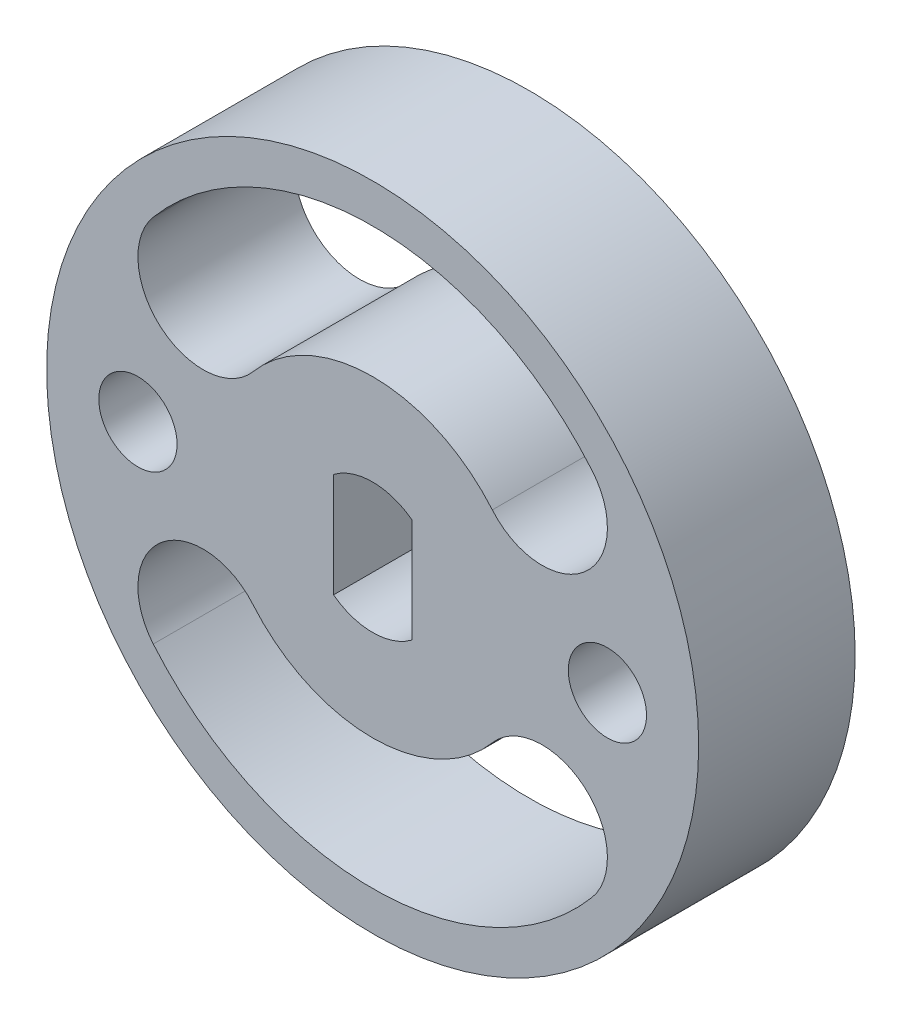
ISO-10303-21;
HEADER;
FILE_DESCRIPTION(('STEP AP214'),'2;1');
FILE_NAME('part.step','',(''),(''),'','','');
FILE_SCHEMA(('AUTOMOTIVE_DESIGN { 1 0 10303 214 1 1 1 1 }'));
ENDSEC;
DATA;
#1=APPLICATION_CONTEXT('core data for automotive mechanical design processes');
#2=APPLICATION_PROTOCOL_DEFINITION('international standard','automotive_design',2000,#1);
#3=PRODUCT_CONTEXT('',#1,'mechanical');
#4=PRODUCT('Part','Part','',(#3));
#5=PRODUCT_RELATED_PRODUCT_CATEGORY('part','',(#4));
#6=PRODUCT_DEFINITION_FORMATION('','',#4);
#7=PRODUCT_DEFINITION_CONTEXT('part definition',#1,'design');
#8=PRODUCT_DEFINITION('design','',#6,#7);
#9=PRODUCT_DEFINITION_SHAPE('','',#8);
#10=(LENGTH_UNIT() NAMED_UNIT(*) SI_UNIT(.MILLI.,.METRE.));
#11=(NAMED_UNIT(*) PLANE_ANGLE_UNIT() SI_UNIT($,.RADIAN.));
#12=(NAMED_UNIT(*) SI_UNIT($,.STERADIAN.) SOLID_ANGLE_UNIT());
#13=UNCERTAINTY_MEASURE_WITH_UNIT(LENGTH_MEASURE(1.E-05),#10,'distance_accuracy_value','');
#14=(GEOMETRIC_REPRESENTATION_CONTEXT(3) GLOBAL_UNCERTAINTY_ASSIGNED_CONTEXT((#13)) GLOBAL_UNIT_ASSIGNED_CONTEXT((#10,
#11,#12)) REPRESENTATION_CONTEXT('',''));
#15=CARTESIAN_POINT('',(0.,0.,0.));
#16=DIRECTION('',(0.,0.,1.));
#17=DIRECTION('',(1.,0.,0.));
#18=AXIS2_PLACEMENT_3D('',#15,#16,#17);
#19=CARTESIAN_POINT('',(0.,0.,6.));
#20=DIRECTION('',(0.,0.,-1.));
#21=DIRECTION('',(-1.,0.,0.));
#22=AXIS2_PLACEMENT_3D('',#19,#20,#21);
#23=CYLINDRICAL_SURFACE('',#22,2.49999999999997);
#24=CARTESIAN_POINT('',(0.,0.,0.));
#25=DIRECTION('',(0.,0.,-1.));
#26=DIRECTION('',(-1.,0.,0.));
#27=AXIS2_PLACEMENT_3D('',#24,#25,#26);
#28=CIRCLE('',#27,2.49999999999997);
#29=CARTESIAN_POINT('',(-1.5,2.,0.));
#30=VERTEX_POINT('',#29);
#31=CARTESIAN_POINT('',(1.5,2.,0.));
#32=VERTEX_POINT('',#31);
#33=EDGE_CURVE('E251',#30,#32,#28,.T.);
#34=ORIENTED_EDGE('',*,*,#33,.T.);
#35=DIRECTION('',(0.,0.,-1.));
#36=VECTOR('',#35,1.);
#37=CARTESIAN_POINT('',(1.5,2.,6.));
#38=LINE('',#37,#36);
#39=CARTESIAN_POINT('',(1.5,2.,6.));
#40=VERTEX_POINT('',#39);
#41=EDGE_CURVE('E11',#40,#32,#38,.T.);
#42=ORIENTED_EDGE('',*,*,#41,.F.);
#43=CARTESIAN_POINT('',(0.,0.,6.));
#44=DIRECTION('',(0.,0.,-1.));
#45=DIRECTION('',(-1.,0.,0.));
#46=AXIS2_PLACEMENT_3D('',#43,#44,#45);
#47=CIRCLE('',#46,2.49999999999997);
#48=CARTESIAN_POINT('',(-1.5,2.,6.));
#49=VERTEX_POINT('',#48);
#50=EDGE_CURVE('E252',#49,#40,#47,.T.);
#51=ORIENTED_EDGE('',*,*,#50,.F.);
#52=DIRECTION('',(0.,0.,-1.));
#53=VECTOR('',#52,1.);
#54=CARTESIAN_POINT('',(-1.5,2.,6.));
#55=LINE('',#54,#53);
#56=EDGE_CURVE('E242',#49,#30,#55,.T.);
#57=ORIENTED_EDGE('',*,*,#56,.T.);
#58=EDGE_LOOP('',(#34,#42,#51,#57));
#59=FACE_BOUND('',#58,.T.);
#60=ADVANCED_FACE('F39',(#59),#23,.F.);
#61=CARTESIAN_POINT('',(1.5,2.,6.));
#62=DIRECTION('',(1.,0.,0.));
#63=DIRECTION('',(0.,1.,0.));
#64=AXIS2_PLACEMENT_3D('',#61,#62,#63);
#65=PLANE('',#64);
#66=DIRECTION('',(0.,-1.,0.));
#67=VECTOR('',#66,1.);
#68=CARTESIAN_POINT('',(1.5,2.,0.));
#69=LINE('',#68,#67);
#70=CARTESIAN_POINT('',(1.5,-2.,0.));
#71=VERTEX_POINT('',#70);
#72=EDGE_CURVE('E270',#32,#71,#69,.T.);
#73=ORIENTED_EDGE('',*,*,#72,.T.);
#74=DIRECTION('',(0.,0.,-1.));
#75=VECTOR('',#74,1.);
#76=CARTESIAN_POINT('',(1.5,-2.,6.));
#77=LINE('',#76,#75);
#78=CARTESIAN_POINT('',(1.5,-2.,6.));
#79=VERTEX_POINT('',#78);
#80=EDGE_CURVE('E186',#79,#71,#77,.T.);
#81=ORIENTED_EDGE('',*,*,#80,.F.);
#82=DIRECTION('',(0.,-1.,0.));
#83=VECTOR('',#82,1.);
#84=CARTESIAN_POINT('',(1.5,2.,6.));
#85=LINE('',#84,#83);
#86=EDGE_CURVE('E256',#40,#79,#85,.T.);
#87=ORIENTED_EDGE('',*,*,#86,.F.);
#88=ORIENTED_EDGE('',*,*,#41,.T.);
#89=EDGE_LOOP('',(#73,#81,#87,#88));
#90=FACE_BOUND('',#89,.T.);
#91=ADVANCED_FACE('F307',(#90),#65,.F.);
#92=CARTESIAN_POINT('',(9.,0.,6.));
#93=DIRECTION('',(0.,0.,-1.));
#94=DIRECTION('',(-1.,0.,0.));
#95=AXIS2_PLACEMENT_3D('',#92,#93,#94);
#96=CYLINDRICAL_SURFACE('',#95,1.5);
#97=CARTESIAN_POINT('',(9.,0.,0.));
#98=DIRECTION('',(0.,0.,-1.));
#99=DIRECTION('',(-1.,0.,0.));
#100=AXIS2_PLACEMENT_3D('',#97,#98,#99);
#101=CIRCLE('',#100,1.5);
#102=CARTESIAN_POINT('',(7.5,0.,0.));
#103=VERTEX_POINT('',#102);
#104=EDGE_CURVE('E273',#103,#103,#101,.T.);
#105=ORIENTED_EDGE('',*,*,#104,.T.);
#106=EDGE_LOOP('',(#105));
#107=FACE_BOUND('',#106,.T.);
#108=CARTESIAN_POINT('',(9.,0.,6.));
#109=DIRECTION('',(0.,0.,-1.));
#110=DIRECTION('',(-1.,0.,0.));
#111=AXIS2_PLACEMENT_3D('',#108,#109,#110);
#112=CIRCLE('',#111,1.5);
#113=CARTESIAN_POINT('',(7.5,0.,6.));
#114=VERTEX_POINT('',#113);
#115=EDGE_CURVE('E260',#114,#114,#112,.T.);
#116=ORIENTED_EDGE('',*,*,#115,.F.);
#117=EDGE_LOOP('',(#116));
#118=FACE_BOUND('',#117,.T.);
#119=ADVANCED_FACE('F309',(#107,#118),#96,.F.);
#120=CARTESIAN_POINT('',(0.,0.,6.));
#121=DIRECTION('',(0.,0.,-1.));
#122=DIRECTION('',(-1.,0.,0.));
#123=AXIS2_PLACEMENT_3D('',#120,#121,#122);
#124=CYLINDRICAL_SURFACE('',#123,12.5);
#125=CARTESIAN_POINT('',(0.,0.,0.));
#126=DIRECTION('',(0.,0.,1.));
#127=DIRECTION('',(1.,0.,0.));
#128=AXIS2_PLACEMENT_3D('',#125,#126,#127);
#129=CIRCLE('',#128,12.5);
#130=CARTESIAN_POINT('',(12.5,0.,0.));
#131=VERTEX_POINT('',#130);
#132=EDGE_CURVE('E257',#131,#131,#129,.T.);
#133=ORIENTED_EDGE('',*,*,#132,.T.);
#134=EDGE_LOOP('',(#133));
#135=FACE_BOUND('',#134,.T.);
#136=CARTESIAN_POINT('',(0.,0.,6.));
#137=DIRECTION('',(0.,0.,1.));
#138=DIRECTION('',(1.,0.,0.));
#139=AXIS2_PLACEMENT_3D('',#136,#137,#138);
#140=CIRCLE('',#139,12.5);
#141=CARTESIAN_POINT('',(12.5,0.,6.));
#142=VERTEX_POINT('',#141);
#143=EDGE_CURVE('E47',#142,#142,#140,.T.);
#144=ORIENTED_EDGE('',*,*,#143,.F.);
#145=EDGE_LOOP('',(#144));
#146=FACE_BOUND('',#145,.T.);
#147=ADVANCED_FACE('F280',(#135,#146),#124,.T.);
#148=CARTESIAN_POINT('',(0.,0.,6.));
#149=DIRECTION('',(0.,0.,-1.));
#150=DIRECTION('',(-1.,0.,0.));
#151=AXIS2_PLACEMENT_3D('',#148,#149,#150);
#152=PLANE('',#151);
#153=ORIENTED_EDGE('',*,*,#115,.T.);
#154=EDGE_LOOP('',(#153));
#155=FACE_BOUND('',#154,.T.);
#156=ORIENTED_EDGE('',*,*,#143,.T.);
#157=EDGE_LOOP('',(#156));
#158=FACE_BOUND('',#157,.T.);
#159=CARTESIAN_POINT('',(-9.,0.,6.));
#160=DIRECTION('',(0.,0.,1.));
#161=DIRECTION('',(1.,0.,0.));
#162=AXIS2_PLACEMENT_3D('',#159,#160,#161);
#163=CIRCLE('',#162,1.5);
#164=CARTESIAN_POINT('',(-7.5,0.,6.));
#165=VERTEX_POINT('',#164);
#166=EDGE_CURVE('E237',#165,#165,#163,.T.);
#167=ORIENTED_EDGE('',*,*,#166,.F.);
#168=EDGE_LOOP('',(#167));
#169=FACE_BOUND('',#168,.T.);
#170=CARTESIAN_POINT('',(-6.5,5.47722557505166,6.));
#171=DIRECTION('',(0.,0.,1.));
#172=DIRECTION('',(1.,0.,0.));
#173=AXIS2_PLACEMENT_3D('',#170,#171,#172);
#174=CIRCLE('',#173,2.5);
#175=CARTESIAN_POINT('',(-8.41176470588235,7.08817427359627,6.));
#176=VERTEX_POINT('',#175);
#177=CARTESIAN_POINT('',(-4.58823529411765,3.86627687650706,6.));
#178=VERTEX_POINT('',#177);
#179=EDGE_CURVE('E197',#176,#178,#174,.T.);
#180=ORIENTED_EDGE('',*,*,#179,.F.);
#181=CARTESIAN_POINT('',(0.,0.,6.));
#182=DIRECTION('',(0.,0.,1.));
#183=DIRECTION('',(1.,0.,0.));
#184=AXIS2_PLACEMENT_3D('',#181,#182,#183);
#185=CIRCLE('',#184,11.);
#186=CARTESIAN_POINT('',(8.41176470588235,7.08817427359627,6.));
#187=VERTEX_POINT('',#186);
#188=EDGE_CURVE('E201',#187,#176,#185,.T.);
#189=ORIENTED_EDGE('',*,*,#188,.F.);
#190=CARTESIAN_POINT('',(6.5,5.47722557505166,6.));
#191=DIRECTION('',(0.,0.,1.));
#192=DIRECTION('',(1.,0.,0.));
#193=AXIS2_PLACEMENT_3D('',#190,#191,#192);
#194=CIRCLE('',#193,2.5);
#195=CARTESIAN_POINT('',(4.58823529411765,3.86627687650706,6.));
#196=VERTEX_POINT('',#195);
#197=EDGE_CURVE('E193',#196,#187,#194,.T.);
#198=ORIENTED_EDGE('',*,*,#197,.F.);
#199=CARTESIAN_POINT('',(0.,0.,6.));
#200=DIRECTION('',(0.,0.,-1.));
#201=DIRECTION('',(1.,0.,0.));
#202=AXIS2_PLACEMENT_3D('',#199,#200,#201);
#203=CIRCLE('',#202,6.);
#204=EDGE_CURVE('E54',#178,#196,#203,.T.);
#205=ORIENTED_EDGE('',*,*,#204,.F.);
#206=EDGE_LOOP('',(#180,#189,#198,#205));
#207=FACE_BOUND('',#206,.T.);
#208=ORIENTED_EDGE('',*,*,#50,.T.);
#209=ORIENTED_EDGE('',*,*,#86,.T.);
#210=CARTESIAN_POINT('',(0.,0.,6.));
#211=DIRECTION('',(0.,0.,1.));
#212=DIRECTION('',(-1.,0.,0.));
#213=AXIS2_PLACEMENT_3D('',#210,#211,#212);
#214=CIRCLE('',#213,2.49999999999997);
#215=CARTESIAN_POINT('',(-1.5,-2.,6.));
#216=VERTEX_POINT('',#215);
#217=EDGE_CURVE('E182',#216,#79,#214,.T.);
#218=ORIENTED_EDGE('',*,*,#217,.F.);
#219=DIRECTION('',(0.,-1.,0.));
#220=VECTOR('',#219,1.);
#221=CARTESIAN_POINT('',(-1.5,2.,6.));
#222=LINE('',#221,#220);
#223=EDGE_CURVE('E234',#49,#216,#222,.T.);
#224=ORIENTED_EDGE('',*,*,#223,.F.);
#225=EDGE_LOOP('',(#208,#209,#218,#224));
#226=FACE_BOUND('',#225,.T.);
#227=CARTESIAN_POINT('',(-6.5,-5.47722557505166,6.));
#228=DIRECTION('',(0.,0.,-1.));
#229=DIRECTION('',(1.,0.,0.));
#230=AXIS2_PLACEMENT_3D('',#227,#228,#229);
#231=CIRCLE('',#230,2.5);
#232=CARTESIAN_POINT('',(-8.41176470588235,-7.08817427359627,6.));
#233=VERTEX_POINT('',#232);
#234=CARTESIAN_POINT('',(-4.58823529411765,-3.86627687650706,6.));
#235=VERTEX_POINT('',#234);
#236=EDGE_CURVE('E135',#233,#235,#231,.T.);
#237=ORIENTED_EDGE('',*,*,#236,.T.);
#238=CARTESIAN_POINT('',(0.,0.,6.));
#239=DIRECTION('',(0.,0.,1.));
#240=DIRECTION('',(1.,0.,0.));
#241=AXIS2_PLACEMENT_3D('',#238,#239,#240);
#242=CIRCLE('',#241,6.);
#243=CARTESIAN_POINT('',(4.58823529411765,-3.86627687650706,6.));
#244=VERTEX_POINT('',#243);
#245=EDGE_CURVE('E156',#235,#244,#242,.T.);
#246=ORIENTED_EDGE('',*,*,#245,.T.);
#247=CARTESIAN_POINT('',(6.5,-5.47722557505166,6.));
#248=DIRECTION('',(0.,0.,-1.));
#249=DIRECTION('',(1.,0.,0.));
#250=AXIS2_PLACEMENT_3D('',#247,#248,#249);
#251=CIRCLE('',#250,2.5);
#252=CARTESIAN_POINT('',(8.41176470588235,-7.08817427359627,6.));
#253=VERTEX_POINT('',#252);
#254=EDGE_CURVE('E163',#244,#253,#251,.T.);
#255=ORIENTED_EDGE('',*,*,#254,.T.);
#256=CARTESIAN_POINT('',(0.,0.,6.));
#257=DIRECTION('',(0.,0.,-1.));
#258=DIRECTION('',(1.,0.,0.));
#259=AXIS2_PLACEMENT_3D('',#256,#257,#258);
#260=CIRCLE('',#259,11.);
#261=EDGE_CURVE('E360',#253,#233,#260,.T.);
#262=ORIENTED_EDGE('',*,*,#261,.T.);
#263=EDGE_LOOP('',(#237,#246,#255,#262));
#264=FACE_BOUND('',#263,.T.);
#265=ADVANCED_FACE('F286',(#155,#158,#169,#207,#226,#264),#152,.F.);
#266=CARTESIAN_POINT('',(0.,0.,0.));
#267=DIRECTION('',(0.,0.,-1.));
#268=DIRECTION('',(-1.,0.,0.));
#269=AXIS2_PLACEMENT_3D('',#266,#267,#268);
#270=PLANE('',#269);
#271=ORIENTED_EDGE('',*,*,#104,.F.);
#272=EDGE_LOOP('',(#271));
#273=FACE_BOUND('',#272,.T.);
#274=ORIENTED_EDGE('',*,*,#132,.F.);
#275=EDGE_LOOP('',(#274));
#276=FACE_BOUND('',#275,.T.);
#277=CARTESIAN_POINT('',(-9.,0.,0.));
#278=DIRECTION('',(0.,0.,1.));
#279=DIRECTION('',(1.,0.,0.));
#280=AXIS2_PLACEMENT_3D('',#277,#278,#279);
#281=CIRCLE('',#280,1.5);
#282=CARTESIAN_POINT('',(-7.5,0.,0.));
#283=VERTEX_POINT('',#282);
#284=EDGE_CURVE('E238',#283,#283,#281,.T.);
#285=ORIENTED_EDGE('',*,*,#284,.T.);
#286=EDGE_LOOP('',(#285));
#287=FACE_BOUND('',#286,.T.);
#288=CARTESIAN_POINT('',(0.,0.,0.));
#289=DIRECTION('',(0.,0.,-1.));
#290=DIRECTION('',(-1.,0.,0.));
#291=AXIS2_PLACEMENT_3D('',#288,#289,#290);
#292=CIRCLE('',#291,11.);
#293=CARTESIAN_POINT('',(8.41176470588235,7.08817427359627,0.));
#294=VERTEX_POINT('',#293);
#295=CARTESIAN_POINT('',(-8.41176470588235,7.08817427359627,0.));
#296=VERTEX_POINT('',#295);
#297=EDGE_CURVE('E196',#294,#296,#292,.F.);
#298=ORIENTED_EDGE('',*,*,#297,.T.);
#299=CARTESIAN_POINT('',(-6.5,5.47722557505166,0.));
#300=DIRECTION('',(0.,0.,-1.));
#301=DIRECTION('',(-1.,0.,0.));
#302=AXIS2_PLACEMENT_3D('',#299,#300,#301);
#303=CIRCLE('',#302,2.5);
#304=CARTESIAN_POINT('',(-4.58823529411765,3.86627687650706,0.));
#305=VERTEX_POINT('',#304);
#306=EDGE_CURVE('E221',#296,#305,#303,.F.);
#307=ORIENTED_EDGE('',*,*,#306,.T.);
#308=CARTESIAN_POINT('',(0.,0.,0.));
#309=DIRECTION('',(0.,0.,-1.));
#310=DIRECTION('',(-1.,0.,0.));
#311=AXIS2_PLACEMENT_3D('',#308,#309,#310);
#312=CIRCLE('',#311,6.);
#313=CARTESIAN_POINT('',(4.58823529411765,3.86627687650706,0.));
#314=VERTEX_POINT('',#313);
#315=EDGE_CURVE('E216',#305,#314,#312,.T.);
#316=ORIENTED_EDGE('',*,*,#315,.T.);
#317=CARTESIAN_POINT('',(6.5,5.47722557505166,0.));
#318=DIRECTION('',(0.,0.,-1.));
#319=DIRECTION('',(-1.,0.,0.));
#320=AXIS2_PLACEMENT_3D('',#317,#318,#319);
#321=CIRCLE('',#320,2.5);
#322=EDGE_CURVE('E211',#314,#294,#321,.F.);
#323=ORIENTED_EDGE('',*,*,#322,.T.);
#324=EDGE_LOOP('',(#298,#307,#316,#323));
#325=FACE_BOUND('',#324,.T.);
#326=ORIENTED_EDGE('',*,*,#33,.F.);
#327=DIRECTION('',(0.,-1.,0.));
#328=VECTOR('',#327,1.);
#329=CARTESIAN_POINT('',(-1.5,2.,0.));
#330=LINE('',#329,#328);
#331=CARTESIAN_POINT('',(-1.5,-2.,0.));
#332=VERTEX_POINT('',#331);
#333=EDGE_CURVE('E233',#30,#332,#330,.T.);
#334=ORIENTED_EDGE('',*,*,#333,.T.);
#335=CARTESIAN_POINT('',(0.,0.,0.));
#336=DIRECTION('',(0.,0.,1.));
#337=DIRECTION('',(-1.,0.,0.));
#338=AXIS2_PLACEMENT_3D('',#335,#336,#337);
#339=CIRCLE('',#338,2.49999999999997);
#340=EDGE_CURVE('E181',#332,#71,#339,.T.);
#341=ORIENTED_EDGE('',*,*,#340,.T.);
#342=ORIENTED_EDGE('',*,*,#72,.F.);
#343=EDGE_LOOP('',(#326,#334,#341,#342));
#344=FACE_BOUND('',#343,.T.);
#345=CARTESIAN_POINT('',(0.,0.,0.));
#346=DIRECTION('',(0.,0.,1.));
#347=DIRECTION('',(-1.,0.,0.));
#348=AXIS2_PLACEMENT_3D('',#345,#346,#347);
#349=CIRCLE('',#348,11.);
#350=CARTESIAN_POINT('',(8.41176470588235,-7.08817427359627,0.));
#351=VERTEX_POINT('',#350);
#352=CARTESIAN_POINT('',(-8.41176470588235,-7.08817427359627,0.));
#353=VERTEX_POINT('',#352);
#354=EDGE_CURVE('E141',#351,#353,#349,.F.);
#355=ORIENTED_EDGE('',*,*,#354,.F.);
#356=CARTESIAN_POINT('',(6.5,-5.47722557505166,0.));
#357=DIRECTION('',(0.,0.,1.));
#358=DIRECTION('',(-1.,0.,0.));
#359=AXIS2_PLACEMENT_3D('',#356,#357,#358);
#360=CIRCLE('',#359,2.5);
#361=CARTESIAN_POINT('',(4.58823529411765,-3.86627687650706,0.));
#362=VERTEX_POINT('',#361);
#363=EDGE_CURVE('E165',#362,#351,#360,.F.);
#364=ORIENTED_EDGE('',*,*,#363,.F.);
#365=CARTESIAN_POINT('',(0.,0.,0.));
#366=DIRECTION('',(0.,0.,1.));
#367=DIRECTION('',(-1.,0.,0.));
#368=AXIS2_PLACEMENT_3D('',#365,#366,#367);
#369=CIRCLE('',#368,6.);
#370=CARTESIAN_POINT('',(-4.58823529411765,-3.86627687650706,0.));
#371=VERTEX_POINT('',#370);
#372=EDGE_CURVE('E148',#371,#362,#369,.T.);
#373=ORIENTED_EDGE('',*,*,#372,.F.);
#374=CARTESIAN_POINT('',(-6.5,-5.47722557505166,0.));
#375=DIRECTION('',(0.,0.,1.));
#376=DIRECTION('',(-1.,0.,0.));
#377=AXIS2_PLACEMENT_3D('',#374,#375,#376);
#378=CIRCLE('',#377,2.5);
#379=EDGE_CURVE('E132',#353,#371,#378,.F.);
#380=ORIENTED_EDGE('',*,*,#379,.F.);
#381=EDGE_LOOP('',(#355,#364,#373,#380));
#382=FACE_BOUND('',#381,.T.);
#383=ADVANCED_FACE('F145',(#273,#276,#287,#325,#344,#382),#270,.T.);
#384=CARTESIAN_POINT('',(-1.5,2.,6.));
#385=DIRECTION('',(-1.,0.,0.));
#386=DIRECTION('',(0.,1.,0.));
#387=AXIS2_PLACEMENT_3D('',#384,#385,#386);
#388=PLANE('',#387);
#389=ORIENTED_EDGE('',*,*,#333,.F.);
#390=ORIENTED_EDGE('',*,*,#56,.F.);
#391=ORIENTED_EDGE('',*,*,#223,.T.);
#392=DIRECTION('',(0.,0.,-1.));
#393=VECTOR('',#392,1.);
#394=CARTESIAN_POINT('',(-1.5,-2.,6.));
#395=LINE('',#394,#393);
#396=EDGE_CURVE('E177',#216,#332,#395,.T.);
#397=ORIENTED_EDGE('',*,*,#396,.T.);
#398=EDGE_LOOP('',(#389,#390,#391,#397));
#399=FACE_BOUND('',#398,.T.);
#400=ADVANCED_FACE('F285',(#399),#388,.F.);
#401=CARTESIAN_POINT('',(-9.,0.,6.));
#402=DIRECTION('',(0.,0.,-1.));
#403=DIRECTION('',(1.,0.,0.));
#404=AXIS2_PLACEMENT_3D('',#401,#402,#403);
#405=CYLINDRICAL_SURFACE('',#404,1.5);
#406=ORIENTED_EDGE('',*,*,#284,.F.);
#407=EDGE_LOOP('',(#406));
#408=FACE_BOUND('',#407,.T.);
#409=ORIENTED_EDGE('',*,*,#166,.T.);
#410=EDGE_LOOP('',(#409));
#411=FACE_BOUND('',#410,.T.);
#412=ADVANCED_FACE('F324',(#408,#411),#405,.F.);
#413=CARTESIAN_POINT('',(0.,0.,-19.7069761626081));
#414=DIRECTION('',(0.,0.,1.));
#415=DIRECTION('',(1.,0.,0.));
#416=AXIS2_PLACEMENT_3D('',#413,#414,#415);
#417=CYLINDRICAL_SURFACE('',#416,11.);
#418=DIRECTION('',(0.,0.,1.));
#419=VECTOR('',#418,1.);
#420=CARTESIAN_POINT('',(8.41176470588235,7.08817427359627,-19.7069761626081));
#421=LINE('',#420,#419);
#422=EDGE_CURVE('E62',#294,#187,#421,.T.);
#423=ORIENTED_EDGE('',*,*,#422,.T.);
#424=ORIENTED_EDGE('',*,*,#188,.T.);
#425=DIRECTION('',(0.,0.,1.));
#426=VECTOR('',#425,1.);
#427=CARTESIAN_POINT('',(-8.41176470588235,7.08817427359627,-19.7069761626081));
#428=LINE('',#427,#426);
#429=EDGE_CURVE('E210',#296,#176,#428,.T.);
#430=ORIENTED_EDGE('',*,*,#429,.F.);
#431=ORIENTED_EDGE('',*,*,#297,.F.);
#432=EDGE_LOOP('',(#423,#424,#430,#431));
#433=FACE_BOUND('',#432,.T.);
#434=ADVANCED_FACE('F327',(#433),#417,.F.);
#435=CARTESIAN_POINT('',(-6.5,5.47722557505166,-19.7069761626081));
#436=DIRECTION('',(0.,0.,1.));
#437=DIRECTION('',(1.,0.,0.));
#438=AXIS2_PLACEMENT_3D('',#435,#436,#437);
#439=CYLINDRICAL_SURFACE('',#438,2.5);
#440=ORIENTED_EDGE('',*,*,#429,.T.);
#441=ORIENTED_EDGE('',*,*,#179,.T.);
#442=DIRECTION('',(0.,0.,1.));
#443=VECTOR('',#442,1.);
#444=CARTESIAN_POINT('',(-4.58823529411765,3.86627687650706,-19.7069761626081));
#445=LINE('',#444,#443);
#446=EDGE_CURVE('E220',#305,#178,#445,.T.);
#447=ORIENTED_EDGE('',*,*,#446,.F.);
#448=ORIENTED_EDGE('',*,*,#306,.F.);
#449=EDGE_LOOP('',(#440,#441,#447,#448));
#450=FACE_BOUND('',#449,.T.);
#451=ADVANCED_FACE('F331',(#450),#439,.F.);
#452=CARTESIAN_POINT('',(0.,0.,-19.7069761626081));
#453=DIRECTION('',(0.,0.,1.));
#454=DIRECTION('',(1.,0.,0.));
#455=AXIS2_PLACEMENT_3D('',#452,#453,#454);
#456=CYLINDRICAL_SURFACE('',#455,6.);
#457=ORIENTED_EDGE('',*,*,#446,.T.);
#458=ORIENTED_EDGE('',*,*,#204,.T.);
#459=DIRECTION('',(0.,0.,1.));
#460=VECTOR('',#459,1.);
#461=CARTESIAN_POINT('',(4.58823529411765,3.86627687650706,-19.7069761626081));
#462=LINE('',#461,#460);
#463=EDGE_CURVE('E215',#314,#196,#462,.T.);
#464=ORIENTED_EDGE('',*,*,#463,.F.);
#465=ORIENTED_EDGE('',*,*,#315,.F.);
#466=EDGE_LOOP('',(#457,#458,#464,#465));
#467=FACE_BOUND('',#466,.T.);
#468=ADVANCED_FACE('F335',(#467),#456,.T.);
#469=CARTESIAN_POINT('',(6.5,5.47722557505166,-19.7069761626081));
#470=DIRECTION('',(0.,0.,1.));
#471=DIRECTION('',(1.,0.,0.));
#472=AXIS2_PLACEMENT_3D('',#469,#470,#471);
#473=CYLINDRICAL_SURFACE('',#472,2.5);
#474=ORIENTED_EDGE('',*,*,#463,.T.);
#475=ORIENTED_EDGE('',*,*,#197,.T.);
#476=ORIENTED_EDGE('',*,*,#422,.F.);
#477=ORIENTED_EDGE('',*,*,#322,.F.);
#478=EDGE_LOOP('',(#474,#475,#476,#477));
#479=FACE_BOUND('',#478,.T.);
#480=ADVANCED_FACE('F339',(#479),#473,.F.);
#481=CARTESIAN_POINT('',(0.,0.,6.));
#482=DIRECTION('',(0.,0.,-1.));
#483=DIRECTION('',(-1.,0.,0.));
#484=AXIS2_PLACEMENT_3D('',#481,#482,#483);
#485=CYLINDRICAL_SURFACE('',#484,2.49999999999997);
#486=ORIENTED_EDGE('',*,*,#340,.F.);
#487=ORIENTED_EDGE('',*,*,#396,.F.);
#488=ORIENTED_EDGE('',*,*,#217,.T.);
#489=ORIENTED_EDGE('',*,*,#80,.T.);
#490=EDGE_LOOP('',(#486,#487,#488,#489));
#491=FACE_BOUND('',#490,.T.);
#492=ADVANCED_FACE('F305',(#491),#485,.F.);
#493=CARTESIAN_POINT('',(0.,0.,-19.7069761626081));
#494=DIRECTION('',(0.,0.,1.));
#495=DIRECTION('',(1.,0.,0.));
#496=AXIS2_PLACEMENT_3D('',#493,#494,#495);
#497=CYLINDRICAL_SURFACE('',#496,11.);
#498=DIRECTION('',(0.,0.,1.));
#499=VECTOR('',#498,1.);
#500=CARTESIAN_POINT('',(8.41176470588235,-7.08817427359627,-19.7069761626081));
#501=LINE('',#500,#499);
#502=EDGE_CURVE('E153',#351,#253,#501,.T.);
#503=ORIENTED_EDGE('',*,*,#502,.F.);
#504=ORIENTED_EDGE('',*,*,#354,.T.);
#505=DIRECTION('',(0.,0.,1.));
#506=VECTOR('',#505,1.);
#507=CARTESIAN_POINT('',(-8.41176470588235,-7.08817427359627,-19.7069761626081));
#508=LINE('',#507,#506);
#509=EDGE_CURVE('E129',#353,#233,#508,.T.);
#510=ORIENTED_EDGE('',*,*,#509,.T.);
#511=ORIENTED_EDGE('',*,*,#261,.F.);
#512=EDGE_LOOP('',(#503,#504,#510,#511));
#513=FACE_BOUND('',#512,.T.);
#514=ADVANCED_FACE('F152',(#513),#497,.F.);
#515=CARTESIAN_POINT('',(-6.5,-5.47722557505166,-19.7069761626081));
#516=DIRECTION('',(0.,0.,1.));
#517=DIRECTION('',(1.,0.,0.));
#518=AXIS2_PLACEMENT_3D('',#515,#516,#517);
#519=CYLINDRICAL_SURFACE('',#518,2.5);
#520=ORIENTED_EDGE('',*,*,#509,.F.);
#521=ORIENTED_EDGE('',*,*,#379,.T.);
#522=DIRECTION('',(0.,0.,1.));
#523=VECTOR('',#522,1.);
#524=CARTESIAN_POINT('',(-4.58823529411765,-3.86627687650706,-19.7069761626081));
#525=LINE('',#524,#523);
#526=EDGE_CURVE('E150',#371,#235,#525,.T.);
#527=ORIENTED_EDGE('',*,*,#526,.T.);
#528=ORIENTED_EDGE('',*,*,#236,.F.);
#529=EDGE_LOOP('',(#520,#521,#527,#528));
#530=FACE_BOUND('',#529,.T.);
#531=ADVANCED_FACE('F131',(#530),#519,.F.);
#532=CARTESIAN_POINT('',(0.,0.,-19.7069761626081));
#533=DIRECTION('',(0.,0.,1.));
#534=DIRECTION('',(1.,0.,0.));
#535=AXIS2_PLACEMENT_3D('',#532,#533,#534);
#536=CYLINDRICAL_SURFACE('',#535,6.);
#537=ORIENTED_EDGE('',*,*,#526,.F.);
#538=ORIENTED_EDGE('',*,*,#372,.T.);
#539=DIRECTION('',(0.,0.,1.));
#540=VECTOR('',#539,1.);
#541=CARTESIAN_POINT('',(4.58823529411765,-3.86627687650706,-19.7069761626081));
#542=LINE('',#541,#540);
#543=EDGE_CURVE('E168',#362,#244,#542,.T.);
#544=ORIENTED_EDGE('',*,*,#543,.T.);
#545=ORIENTED_EDGE('',*,*,#245,.F.);
#546=EDGE_LOOP('',(#537,#538,#544,#545));
#547=FACE_BOUND('',#546,.T.);
#548=ADVANCED_FACE('F348',(#547),#536,.T.);
#549=CARTESIAN_POINT('',(6.5,-5.47722557505166,-19.7069761626081));
#550=DIRECTION('',(0.,0.,1.));
#551=DIRECTION('',(1.,0.,0.));
#552=AXIS2_PLACEMENT_3D('',#549,#550,#551);
#553=CYLINDRICAL_SURFACE('',#552,2.5);
#554=ORIENTED_EDGE('',*,*,#543,.F.);
#555=ORIENTED_EDGE('',*,*,#363,.T.);
#556=ORIENTED_EDGE('',*,*,#502,.T.);
#557=ORIENTED_EDGE('',*,*,#254,.F.);
#558=EDGE_LOOP('',(#554,#555,#556,#557));
#559=FACE_BOUND('',#558,.T.);
#560=ADVANCED_FACE('F351',(#559),#553,.F.);
#561=CLOSED_SHELL('',(#60,#91,#119,#147,#265,#383,#400,#412,#434,#451,#468,#480,#492,#514,#531,
#548,#560));
#562=MANIFOLD_SOLID_BREP('B2',#561);
#563=ADVANCED_BREP_SHAPE_REPRESENTATION('',(#18,#562),#14);
#564=SHAPE_DEFINITION_REPRESENTATION(#9,#563);
ENDSEC;
END-ISO-10303-21;
